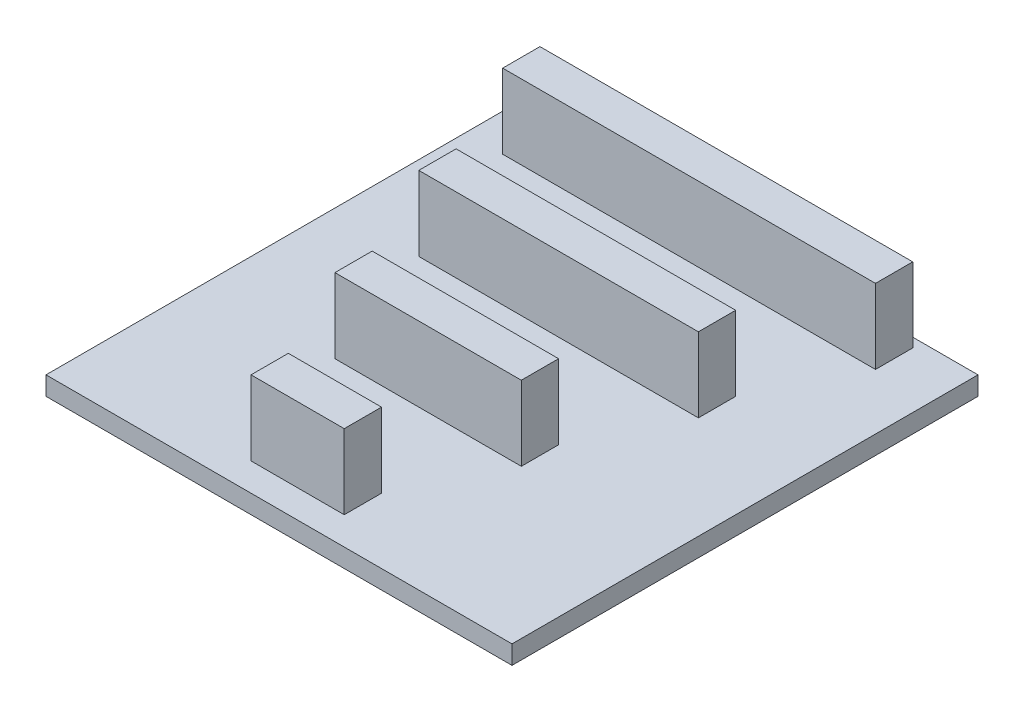
ISO-10303-21;
HEADER;
FILE_DESCRIPTION(('STEP AP214'),'2;1');
FILE_NAME('part.step','',(''),(''),'','','');
FILE_SCHEMA(('AUTOMOTIVE_DESIGN { 1 0 10303 214 1 1 1 1 }'));
ENDSEC;
DATA;
#1=APPLICATION_CONTEXT('core data for automotive mechanical design processes');
#2=APPLICATION_PROTOCOL_DEFINITION('international standard','automotive_design',2000,#1);
#3=PRODUCT_CONTEXT('',#1,'mechanical');
#4=PRODUCT('Part','Part','',(#3));
#5=PRODUCT_RELATED_PRODUCT_CATEGORY('part','',(#4));
#6=PRODUCT_DEFINITION_FORMATION('','',#4);
#7=PRODUCT_DEFINITION_CONTEXT('part definition',#1,'design');
#8=PRODUCT_DEFINITION('design','',#6,#7);
#9=PRODUCT_DEFINITION_SHAPE('','',#8);
#10=(LENGTH_UNIT() NAMED_UNIT(*) SI_UNIT(.MILLI.,.METRE.));
#11=(NAMED_UNIT(*) PLANE_ANGLE_UNIT() SI_UNIT($,.RADIAN.));
#12=(NAMED_UNIT(*) SI_UNIT($,.STERADIAN.) SOLID_ANGLE_UNIT());
#13=UNCERTAINTY_MEASURE_WITH_UNIT(LENGTH_MEASURE(1.E-05),#10,'distance_accuracy_value','');
#14=(GEOMETRIC_REPRESENTATION_CONTEXT(3) GLOBAL_UNCERTAINTY_ASSIGNED_CONTEXT((#13)) GLOBAL_UNIT_ASSIGNED_CONTEXT((#10,
#11,#12)) REPRESENTATION_CONTEXT('',''));
#15=CARTESIAN_POINT('',(0.,0.,0.));
#16=DIRECTION('',(0.,0.,1.));
#17=DIRECTION('',(1.,0.,0.));
#18=AXIS2_PLACEMENT_3D('',#15,#16,#17);
#19=CARTESIAN_POINT('',(-25.,-2.,25.));
#20=DIRECTION('',(-1.,0.,0.));
#21=DIRECTION('',(0.,0.,1.));
#22=AXIS2_PLACEMENT_3D('',#19,#20,#21);
#23=PLANE('',#22);
#24=DIRECTION('',(0.,0.,1.));
#25=VECTOR('',#24,1.);
#26=CARTESIAN_POINT('',(-25.,0.,25.));
#27=LINE('',#26,#25);
#28=CARTESIAN_POINT('',(-25.,0.,-25.));
#29=VERTEX_POINT('',#28);
#30=CARTESIAN_POINT('',(-25.,0.,25.));
#31=VERTEX_POINT('',#30);
#32=EDGE_CURVE('E108',#29,#31,#27,.T.);
#33=ORIENTED_EDGE('',*,*,#32,.F.);
#34=DIRECTION('',(0.,1.,0.));
#35=VECTOR('',#34,1.);
#36=CARTESIAN_POINT('',(-25.,-2.,-25.));
#37=LINE('',#36,#35);
#38=CARTESIAN_POINT('',(-25.,-2.,-25.));
#39=VERTEX_POINT('',#38);
#40=EDGE_CURVE('E12',#39,#29,#37,.T.);
#41=ORIENTED_EDGE('',*,*,#40,.F.);
#42=DIRECTION('',(0.,0.,1.));
#43=VECTOR('',#42,1.);
#44=CARTESIAN_POINT('',(-25.,-2.,25.));
#45=LINE('',#44,#43);
#46=CARTESIAN_POINT('',(-25.,-2.,25.));
#47=VERTEX_POINT('',#46);
#48=EDGE_CURVE('E102',#39,#47,#45,.T.);
#49=ORIENTED_EDGE('',*,*,#48,.T.);
#50=DIRECTION('',(0.,1.,0.));
#51=VECTOR('',#50,1.);
#52=CARTESIAN_POINT('',(-25.,-2.,25.));
#53=LINE('',#52,#51);
#54=EDGE_CURVE('E47',#47,#31,#53,.T.);
#55=ORIENTED_EDGE('',*,*,#54,.T.);
#56=EDGE_LOOP('',(#33,#41,#49,#55));
#57=FACE_BOUND('',#56,.T.);
#58=ADVANCED_FACE('F44',(#57),#23,.T.);
#59=CARTESIAN_POINT('',(25.,-2.,-25.));
#60=DIRECTION('',(0.,0.,-1.));
#61=DIRECTION('',(-1.,0.,0.));
#62=AXIS2_PLACEMENT_3D('',#59,#60,#61);
#63=PLANE('',#62);
#64=DIRECTION('',(-1.,0.,0.));
#65=VECTOR('',#64,1.);
#66=CARTESIAN_POINT('',(25.,0.,-25.));
#67=LINE('',#66,#65);
#68=CARTESIAN_POINT('',(25.,0.,-25.));
#69=VERTEX_POINT('',#68);
#70=EDGE_CURVE('E104',#69,#29,#67,.T.);
#71=ORIENTED_EDGE('',*,*,#70,.F.);
#72=DIRECTION('',(0.,1.,0.));
#73=VECTOR('',#72,1.);
#74=CARTESIAN_POINT('',(25.,-2.,-25.));
#75=LINE('',#74,#73);
#76=CARTESIAN_POINT('',(25.,-2.,-25.));
#77=VERTEX_POINT('',#76);
#78=EDGE_CURVE('E53',#77,#69,#75,.T.);
#79=ORIENTED_EDGE('',*,*,#78,.F.);
#80=DIRECTION('',(-1.,0.,0.));
#81=VECTOR('',#80,1.);
#82=CARTESIAN_POINT('',(25.,-2.,-25.));
#83=LINE('',#82,#81);
#84=EDGE_CURVE('E99',#77,#39,#83,.T.);
#85=ORIENTED_EDGE('',*,*,#84,.T.);
#86=ORIENTED_EDGE('',*,*,#40,.T.);
#87=EDGE_LOOP('',(#71,#79,#85,#86));
#88=FACE_BOUND('',#87,.T.);
#89=ADVANCED_FACE('F118',(#88),#63,.T.);
#90=CARTESIAN_POINT('',(25.,-2.,25.));
#91=DIRECTION('',(1.,0.,0.));
#92=DIRECTION('',(0.,0.,-1.));
#93=AXIS2_PLACEMENT_3D('',#90,#91,#92);
#94=PLANE('',#93);
#95=DIRECTION('',(0.,0.,-1.));
#96=VECTOR('',#95,1.);
#97=CARTESIAN_POINT('',(25.,0.,25.));
#98=LINE('',#97,#96);
#99=CARTESIAN_POINT('',(25.,0.,25.));
#100=VERTEX_POINT('',#99);
#101=EDGE_CURVE('E94',#100,#69,#98,.T.);
#102=ORIENTED_EDGE('',*,*,#101,.F.);
#103=DIRECTION('',(0.,1.,0.));
#104=VECTOR('',#103,1.);
#105=CARTESIAN_POINT('',(25.,-2.,25.));
#106=LINE('',#105,#104);
#107=CARTESIAN_POINT('',(25.,-2.,25.));
#108=VERTEX_POINT('',#107);
#109=EDGE_CURVE('E89',#108,#100,#106,.T.);
#110=ORIENTED_EDGE('',*,*,#109,.F.);
#111=DIRECTION('',(0.,0.,-1.));
#112=VECTOR('',#111,1.);
#113=CARTESIAN_POINT('',(25.,-2.,25.));
#114=LINE('',#113,#112);
#115=EDGE_CURVE('E92',#108,#77,#114,.T.);
#116=ORIENTED_EDGE('',*,*,#115,.T.);
#117=ORIENTED_EDGE('',*,*,#78,.T.);
#118=EDGE_LOOP('',(#102,#110,#116,#117));
#119=FACE_BOUND('',#118,.T.);
#120=ADVANCED_FACE('F91',(#119),#94,.T.);
#121=CARTESIAN_POINT('',(25.,-2.,25.));
#122=DIRECTION('',(0.,0.,1.));
#123=DIRECTION('',(1.,0.,0.));
#124=AXIS2_PLACEMENT_3D('',#121,#122,#123);
#125=PLANE('',#124);
#126=DIRECTION('',(1.,0.,0.));
#127=VECTOR('',#126,1.);
#128=CARTESIAN_POINT('',(25.,0.,25.));
#129=LINE('',#128,#127);
#130=EDGE_CURVE('E111',#31,#100,#129,.T.);
#131=ORIENTED_EDGE('',*,*,#130,.F.);
#132=ORIENTED_EDGE('',*,*,#54,.F.);
#133=DIRECTION('',(1.,0.,0.));
#134=VECTOR('',#133,1.);
#135=CARTESIAN_POINT('',(25.,-2.,25.));
#136=LINE('',#135,#134);
#137=EDGE_CURVE('E98',#47,#108,#136,.T.);
#138=ORIENTED_EDGE('',*,*,#137,.T.);
#139=ORIENTED_EDGE('',*,*,#109,.T.);
#140=EDGE_LOOP('',(#131,#132,#138,#139));
#141=FACE_BOUND('',#140,.T.);
#142=ADVANCED_FACE('F101',(#141),#125,.T.);
#143=CARTESIAN_POINT('',(0.,-2.,0.));
#144=DIRECTION('',(0.,1.,0.));
#145=DIRECTION('',(0.,0.,1.));
#146=AXIS2_PLACEMENT_3D('',#143,#144,#145);
#147=PLANE('',#146);
#148=ORIENTED_EDGE('',*,*,#48,.F.);
#149=ORIENTED_EDGE('',*,*,#84,.F.);
#150=ORIENTED_EDGE('',*,*,#115,.F.);
#151=ORIENTED_EDGE('',*,*,#137,.F.);
#152=EDGE_LOOP('',(#148,#149,#150,#151));
#153=FACE_BOUND('',#152,.T.);
#154=ADVANCED_FACE('F97',(#153),#147,.F.);
#155=CARTESIAN_POINT('',(0.,0.,0.));
#156=DIRECTION('',(0.,1.,0.));
#157=DIRECTION('',(0.,0.,1.));
#158=AXIS2_PLACEMENT_3D('',#155,#156,#157);
#159=PLANE('',#158);
#160=ORIENTED_EDGE('',*,*,#32,.T.);
#161=ORIENTED_EDGE('',*,*,#130,.T.);
#162=ORIENTED_EDGE('',*,*,#101,.T.);
#163=ORIENTED_EDGE('',*,*,#70,.T.);
#164=EDGE_LOOP('',(#160,#161,#162,#163));
#165=FACE_BOUND('',#164,.T.);
#166=ADVANCED_FACE('F117',(#165),#159,.T.);
#167=CLOSED_SHELL('',(#58,#89,#120,#142,#154,#166));
#168=MANIFOLD_SOLID_BREP('B2',#167);
#169=CARTESIAN_POINT('',(-20.,9.,-23.));
#170=DIRECTION('',(1.,0.,0.));
#171=DIRECTION('',(0.,0.,-1.));
#172=AXIS2_PLACEMENT_3D('',#169,#170,#171);
#173=PLANE('',#172);
#174=DIRECTION('',(0.,0.,1.));
#175=VECTOR('',#174,1.);
#176=CARTESIAN_POINT('',(-20.,1.,-23.));
#177=LINE('',#176,#175);
#178=CARTESIAN_POINT('',(-20.,1.,-23.));
#179=VERTEX_POINT('',#178);
#180=CARTESIAN_POINT('',(-20.,1.,-19.));
#181=VERTEX_POINT('',#180);
#182=EDGE_CURVE('E241',#179,#181,#177,.T.);
#183=ORIENTED_EDGE('',*,*,#182,.T.);
#184=DIRECTION('',(0.,-1.,0.));
#185=VECTOR('',#184,1.);
#186=CARTESIAN_POINT('',(-20.,9.,-19.));
#187=LINE('',#186,#185);
#188=CARTESIAN_POINT('',(-20.,9.,-19.));
#189=VERTEX_POINT('',#188);
#190=EDGE_CURVE('E42',#189,#181,#187,.T.);
#191=ORIENTED_EDGE('',*,*,#190,.F.);
#192=DIRECTION('',(0.,0.,1.));
#193=VECTOR('',#192,1.);
#194=CARTESIAN_POINT('',(-20.,9.,-23.));
#195=LINE('',#194,#193);
#196=CARTESIAN_POINT('',(-20.,9.,-23.));
#197=VERTEX_POINT('',#196);
#198=EDGE_CURVE('E229',#197,#189,#195,.T.);
#199=ORIENTED_EDGE('',*,*,#198,.F.);
#200=DIRECTION('',(0.,-1.,0.));
#201=VECTOR('',#200,1.);
#202=CARTESIAN_POINT('',(-20.,9.,-23.));
#203=LINE('',#202,#201);
#204=EDGE_CURVE('E237',#197,#179,#203,.T.);
#205=ORIENTED_EDGE('',*,*,#204,.T.);
#206=EDGE_LOOP('',(#183,#191,#199,#205));
#207=FACE_BOUND('',#206,.T.);
#208=ADVANCED_FACE('F178',(#207),#173,.F.);
#209=CARTESIAN_POINT('',(-20.,9.,-19.));
#210=DIRECTION('',(0.,0.,-1.));
#211=DIRECTION('',(-1.,0.,0.));
#212=AXIS2_PLACEMENT_3D('',#209,#210,#211);
#213=PLANE('',#212);
#214=DIRECTION('',(1.,0.,0.));
#215=VECTOR('',#214,1.);
#216=CARTESIAN_POINT('',(-20.,1.,-19.));
#217=LINE('',#216,#215);
#218=CARTESIAN_POINT('',(20.,1.,-19.));
#219=VERTEX_POINT('',#218);
#220=EDGE_CURVE('E233',#181,#219,#217,.T.);
#221=ORIENTED_EDGE('',*,*,#220,.T.);
#222=DIRECTION('',(0.,-1.,0.));
#223=VECTOR('',#222,1.);
#224=CARTESIAN_POINT('',(20.,9.,-19.));
#225=LINE('',#224,#223);
#226=CARTESIAN_POINT('',(20.,9.,-19.));
#227=VERTEX_POINT('',#226);
#228=EDGE_CURVE('E186',#227,#219,#225,.T.);
#229=ORIENTED_EDGE('',*,*,#228,.F.);
#230=DIRECTION('',(1.,0.,0.));
#231=VECTOR('',#230,1.);
#232=CARTESIAN_POINT('',(-20.,9.,-19.));
#233=LINE('',#232,#231);
#234=EDGE_CURVE('E224',#189,#227,#233,.T.);
#235=ORIENTED_EDGE('',*,*,#234,.F.);
#236=ORIENTED_EDGE('',*,*,#190,.T.);
#237=EDGE_LOOP('',(#221,#229,#235,#236));
#238=FACE_BOUND('',#237,.T.);
#239=ADVANCED_FACE('F232',(#238),#213,.F.);
#240=CARTESIAN_POINT('',(20.,9.,-23.));
#241=DIRECTION('',(-1.,0.,0.));
#242=DIRECTION('',(0.,0.,1.));
#243=AXIS2_PLACEMENT_3D('',#240,#241,#242);
#244=PLANE('',#243);
#245=DIRECTION('',(0.,0.,-1.));
#246=VECTOR('',#245,1.);
#247=CARTESIAN_POINT('',(20.,1.,-23.));
#248=LINE('',#247,#246);
#249=CARTESIAN_POINT('',(20.,1.,-23.));
#250=VERTEX_POINT('',#249);
#251=EDGE_CURVE('E211',#219,#250,#248,.T.);
#252=ORIENTED_EDGE('',*,*,#251,.T.);
#253=DIRECTION('',(0.,-1.,0.));
#254=VECTOR('',#253,1.);
#255=CARTESIAN_POINT('',(20.,9.,-23.));
#256=LINE('',#255,#254);
#257=CARTESIAN_POINT('',(20.,9.,-23.));
#258=VERTEX_POINT('',#257);
#259=EDGE_CURVE('E234',#258,#250,#256,.T.);
#260=ORIENTED_EDGE('',*,*,#259,.F.);
#261=DIRECTION('',(0.,0.,-1.));
#262=VECTOR('',#261,1.);
#263=CARTESIAN_POINT('',(20.,9.,-23.));
#264=LINE('',#263,#262);
#265=EDGE_CURVE('E227',#227,#258,#264,.T.);
#266=ORIENTED_EDGE('',*,*,#265,.F.);
#267=ORIENTED_EDGE('',*,*,#228,.T.);
#268=EDGE_LOOP('',(#252,#260,#266,#267));
#269=FACE_BOUND('',#268,.T.);
#270=ADVANCED_FACE('F235',(#269),#244,.F.);
#271=CARTESIAN_POINT('',(-20.,9.,-23.));
#272=DIRECTION('',(0.,0.,1.));
#273=DIRECTION('',(1.,0.,0.));
#274=AXIS2_PLACEMENT_3D('',#271,#272,#273);
#275=PLANE('',#274);
#276=DIRECTION('',(-1.,0.,0.));
#277=VECTOR('',#276,1.);
#278=CARTESIAN_POINT('',(-20.,1.,-23.));
#279=LINE('',#278,#277);
#280=EDGE_CURVE('E217',#250,#179,#279,.T.);
#281=ORIENTED_EDGE('',*,*,#280,.T.);
#282=ORIENTED_EDGE('',*,*,#204,.F.);
#283=DIRECTION('',(-1.,0.,0.));
#284=VECTOR('',#283,1.);
#285=CARTESIAN_POINT('',(-20.,9.,-23.));
#286=LINE('',#285,#284);
#287=EDGE_CURVE('E194',#258,#197,#286,.T.);
#288=ORIENTED_EDGE('',*,*,#287,.F.);
#289=ORIENTED_EDGE('',*,*,#259,.T.);
#290=EDGE_LOOP('',(#281,#282,#288,#289));
#291=FACE_BOUND('',#290,.T.);
#292=ADVANCED_FACE('F248',(#291),#275,.F.);
#293=CARTESIAN_POINT('',(0.,9.,0.));
#294=DIRECTION('',(0.,1.,0.));
#295=DIRECTION('',(0.,0.,1.));
#296=AXIS2_PLACEMENT_3D('',#293,#294,#295);
#297=PLANE('',#296);
#298=ORIENTED_EDGE('',*,*,#198,.T.);
#299=ORIENTED_EDGE('',*,*,#234,.T.);
#300=ORIENTED_EDGE('',*,*,#265,.T.);
#301=ORIENTED_EDGE('',*,*,#287,.T.);
#302=EDGE_LOOP('',(#298,#299,#300,#301));
#303=FACE_BOUND('',#302,.T.);
#304=ADVANCED_FACE('F225',(#303),#297,.T.);
#305=CARTESIAN_POINT('',(0.,1.,0.));
#306=DIRECTION('',(0.,1.,0.));
#307=DIRECTION('',(0.,0.,1.));
#308=AXIS2_PLACEMENT_3D('',#305,#306,#307);
#309=PLANE('',#308);
#310=ORIENTED_EDGE('',*,*,#182,.F.);
#311=ORIENTED_EDGE('',*,*,#280,.F.);
#312=ORIENTED_EDGE('',*,*,#251,.F.);
#313=ORIENTED_EDGE('',*,*,#220,.F.);
#314=EDGE_LOOP('',(#310,#311,#312,#313));
#315=FACE_BOUND('',#314,.T.);
#316=ADVANCED_FACE('F251',(#315),#309,.F.);
#317=CLOSED_SHELL('',(#208,#239,#270,#292,#304,#316));
#318=MANIFOLD_SOLID_BREP('B6',#317);
#319=CARTESIAN_POINT('',(-15.,9.,-9.00000000000002));
#320=DIRECTION('',(1.,0.,0.));
#321=DIRECTION('',(0.,0.,-1.));
#322=AXIS2_PLACEMENT_3D('',#319,#320,#321);
#323=PLANE('',#322);
#324=DIRECTION('',(0.,0.,1.));
#325=VECTOR('',#324,1.);
#326=CARTESIAN_POINT('',(-15.,1.,-9.00000000000002));
#327=LINE('',#326,#325);
#328=CARTESIAN_POINT('',(-15.,1.,-9.00000000000002));
#329=VERTEX_POINT('',#328);
#330=CARTESIAN_POINT('',(-15.,1.,-5.00000000000002));
#331=VERTEX_POINT('',#330);
#332=EDGE_CURVE('E375',#329,#331,#327,.T.);
#333=ORIENTED_EDGE('',*,*,#332,.T.);
#334=DIRECTION('',(0.,-1.,0.));
#335=VECTOR('',#334,1.);
#336=CARTESIAN_POINT('',(-15.,9.,-5.00000000000002));
#337=LINE('',#336,#335);
#338=CARTESIAN_POINT('',(-15.,9.,-5.00000000000002));
#339=VERTEX_POINT('',#338);
#340=EDGE_CURVE('E176',#339,#331,#337,.T.);
#341=ORIENTED_EDGE('',*,*,#340,.F.);
#342=DIRECTION('',(0.,0.,1.));
#343=VECTOR('',#342,1.);
#344=CARTESIAN_POINT('',(-15.,9.,-9.00000000000002));
#345=LINE('',#344,#343);
#346=CARTESIAN_POINT('',(-15.,9.,-9.00000000000002));
#347=VERTEX_POINT('',#346);
#348=EDGE_CURVE('E363',#347,#339,#345,.T.);
#349=ORIENTED_EDGE('',*,*,#348,.F.);
#350=DIRECTION('',(0.,-1.,0.));
#351=VECTOR('',#350,1.);
#352=CARTESIAN_POINT('',(-15.,9.,-9.00000000000002));
#353=LINE('',#352,#351);
#354=EDGE_CURVE('E371',#347,#329,#353,.T.);
#355=ORIENTED_EDGE('',*,*,#354,.T.);
#356=EDGE_LOOP('',(#333,#341,#349,#355));
#357=FACE_BOUND('',#356,.T.);
#358=ADVANCED_FACE('F312',(#357),#323,.F.);
#359=CARTESIAN_POINT('',(-15.,9.,-5.00000000000002));
#360=DIRECTION('',(0.,0.,-1.));
#361=DIRECTION('',(-1.,0.,0.));
#362=AXIS2_PLACEMENT_3D('',#359,#360,#361);
#363=PLANE('',#362);
#364=DIRECTION('',(1.,0.,0.));
#365=VECTOR('',#364,1.);
#366=CARTESIAN_POINT('',(-15.,1.,-5.00000000000002));
#367=LINE('',#366,#365);
#368=CARTESIAN_POINT('',(15.,1.,-5.00000000000002));
#369=VERTEX_POINT('',#368);
#370=EDGE_CURVE('E367',#331,#369,#367,.T.);
#371=ORIENTED_EDGE('',*,*,#370,.T.);
#372=DIRECTION('',(0.,-1.,0.));
#373=VECTOR('',#372,1.);
#374=CARTESIAN_POINT('',(15.,9.,-5.00000000000002));
#375=LINE('',#374,#373);
#376=CARTESIAN_POINT('',(15.,9.,-5.00000000000002));
#377=VERTEX_POINT('',#376);
#378=EDGE_CURVE('E320',#377,#369,#375,.T.);
#379=ORIENTED_EDGE('',*,*,#378,.F.);
#380=DIRECTION('',(1.,0.,0.));
#381=VECTOR('',#380,1.);
#382=CARTESIAN_POINT('',(-15.,9.,-5.00000000000002));
#383=LINE('',#382,#381);
#384=EDGE_CURVE('E358',#339,#377,#383,.T.);
#385=ORIENTED_EDGE('',*,*,#384,.F.);
#386=ORIENTED_EDGE('',*,*,#340,.T.);
#387=EDGE_LOOP('',(#371,#379,#385,#386));
#388=FACE_BOUND('',#387,.T.);
#389=ADVANCED_FACE('F366',(#388),#363,.F.);
#390=CARTESIAN_POINT('',(15.,9.,-9.00000000000002));
#391=DIRECTION('',(-1.,0.,0.));
#392=DIRECTION('',(0.,0.,1.));
#393=AXIS2_PLACEMENT_3D('',#390,#391,#392);
#394=PLANE('',#393);
#395=DIRECTION('',(0.,0.,-1.));
#396=VECTOR('',#395,1.);
#397=CARTESIAN_POINT('',(15.,1.,-9.00000000000002));
#398=LINE('',#397,#396);
#399=CARTESIAN_POINT('',(15.,1.,-9.00000000000002));
#400=VERTEX_POINT('',#399);
#401=EDGE_CURVE('E345',#369,#400,#398,.T.);
#402=ORIENTED_EDGE('',*,*,#401,.T.);
#403=DIRECTION('',(0.,-1.,0.));
#404=VECTOR('',#403,1.);
#405=CARTESIAN_POINT('',(15.,9.,-9.00000000000002));
#406=LINE('',#405,#404);
#407=CARTESIAN_POINT('',(15.,9.,-9.00000000000002));
#408=VERTEX_POINT('',#407);
#409=EDGE_CURVE('E368',#408,#400,#406,.T.);
#410=ORIENTED_EDGE('',*,*,#409,.F.);
#411=DIRECTION('',(0.,0.,-1.));
#412=VECTOR('',#411,1.);
#413=CARTESIAN_POINT('',(15.,9.,-9.00000000000002));
#414=LINE('',#413,#412);
#415=EDGE_CURVE('E361',#377,#408,#414,.T.);
#416=ORIENTED_EDGE('',*,*,#415,.F.);
#417=ORIENTED_EDGE('',*,*,#378,.T.);
#418=EDGE_LOOP('',(#402,#410,#416,#417));
#419=FACE_BOUND('',#418,.T.);
#420=ADVANCED_FACE('F369',(#419),#394,.F.);
#421=CARTESIAN_POINT('',(-15.,9.,-9.00000000000002));
#422=DIRECTION('',(0.,0.,1.));
#423=DIRECTION('',(1.,0.,0.));
#424=AXIS2_PLACEMENT_3D('',#421,#422,#423);
#425=PLANE('',#424);
#426=DIRECTION('',(-1.,0.,0.));
#427=VECTOR('',#426,1.);
#428=CARTESIAN_POINT('',(-15.,1.,-9.00000000000002));
#429=LINE('',#428,#427);
#430=EDGE_CURVE('E351',#400,#329,#429,.T.);
#431=ORIENTED_EDGE('',*,*,#430,.T.);
#432=ORIENTED_EDGE('',*,*,#354,.F.);
#433=DIRECTION('',(-1.,0.,0.));
#434=VECTOR('',#433,1.);
#435=CARTESIAN_POINT('',(-15.,9.,-9.00000000000002));
#436=LINE('',#435,#434);
#437=EDGE_CURVE('E328',#408,#347,#436,.T.);
#438=ORIENTED_EDGE('',*,*,#437,.F.);
#439=ORIENTED_EDGE('',*,*,#409,.T.);
#440=EDGE_LOOP('',(#431,#432,#438,#439));
#441=FACE_BOUND('',#440,.T.);
#442=ADVANCED_FACE('F382',(#441),#425,.F.);
#443=CARTESIAN_POINT('',(0.,9.,0.));
#444=DIRECTION('',(0.,1.,0.));
#445=DIRECTION('',(0.,0.,1.));
#446=AXIS2_PLACEMENT_3D('',#443,#444,#445);
#447=PLANE('',#446);
#448=ORIENTED_EDGE('',*,*,#348,.T.);
#449=ORIENTED_EDGE('',*,*,#384,.T.);
#450=ORIENTED_EDGE('',*,*,#415,.T.);
#451=ORIENTED_EDGE('',*,*,#437,.T.);
#452=EDGE_LOOP('',(#448,#449,#450,#451));
#453=FACE_BOUND('',#452,.T.);
#454=ADVANCED_FACE('F359',(#453),#447,.T.);
#455=CARTESIAN_POINT('',(0.,1.,0.));
#456=DIRECTION('',(0.,1.,0.));
#457=DIRECTION('',(0.,0.,1.));
#458=AXIS2_PLACEMENT_3D('',#455,#456,#457);
#459=PLANE('',#458);
#460=ORIENTED_EDGE('',*,*,#332,.F.);
#461=ORIENTED_EDGE('',*,*,#430,.F.);
#462=ORIENTED_EDGE('',*,*,#401,.F.);
#463=ORIENTED_EDGE('',*,*,#370,.F.);
#464=EDGE_LOOP('',(#460,#461,#462,#463));
#465=FACE_BOUND('',#464,.T.);
#466=ADVANCED_FACE('F385',(#465),#459,.F.);
#467=CLOSED_SHELL('',(#358,#389,#420,#442,#454,#466));
#468=MANIFOLD_SOLID_BREP('B36',#467);
#469=CARTESIAN_POINT('',(-10.,9.,4.99999999999998));
#470=DIRECTION('',(1.,0.,0.));
#471=DIRECTION('',(0.,0.,-1.));
#472=AXIS2_PLACEMENT_3D('',#469,#470,#471);
#473=PLANE('',#472);
#474=DIRECTION('',(0.,0.,1.));
#475=VECTOR('',#474,1.);
#476=CARTESIAN_POINT('',(-10.,1.,4.99999999999998));
#477=LINE('',#476,#475);
#478=CARTESIAN_POINT('',(-10.,1.,4.99999999999998));
#479=VERTEX_POINT('',#478);
#480=CARTESIAN_POINT('',(-10.,1.,8.99999999999998));
#481=VERTEX_POINT('',#480);
#482=EDGE_CURVE('E508',#479,#481,#477,.T.);
#483=ORIENTED_EDGE('',*,*,#482,.T.);
#484=DIRECTION('',(0.,-1.,0.));
#485=VECTOR('',#484,1.);
#486=CARTESIAN_POINT('',(-10.,9.,8.99999999999998));
#487=LINE('',#486,#485);
#488=CARTESIAN_POINT('',(-10.,9.,8.99999999999998));
#489=VERTEX_POINT('',#488);
#490=EDGE_CURVE('E310',#489,#481,#487,.T.);
#491=ORIENTED_EDGE('',*,*,#490,.F.);
#492=DIRECTION('',(0.,0.,1.));
#493=VECTOR('',#492,1.);
#494=CARTESIAN_POINT('',(-10.,9.,4.99999999999998));
#495=LINE('',#494,#493);
#496=CARTESIAN_POINT('',(-10.,9.,4.99999999999998));
#497=VERTEX_POINT('',#496);
#498=EDGE_CURVE('E496',#497,#489,#495,.T.);
#499=ORIENTED_EDGE('',*,*,#498,.F.);
#500=DIRECTION('',(0.,-1.,0.));
#501=VECTOR('',#500,1.);
#502=CARTESIAN_POINT('',(-10.,9.,4.99999999999998));
#503=LINE('',#502,#501);
#504=EDGE_CURVE('E504',#497,#479,#503,.T.);
#505=ORIENTED_EDGE('',*,*,#504,.T.);
#506=EDGE_LOOP('',(#483,#491,#499,#505));
#507=FACE_BOUND('',#506,.T.);
#508=ADVANCED_FACE('F445',(#507),#473,.F.);
#509=CARTESIAN_POINT('',(-10.,9.,8.99999999999998));
#510=DIRECTION('',(0.,0.,-1.));
#511=DIRECTION('',(-1.,0.,0.));
#512=AXIS2_PLACEMENT_3D('',#509,#510,#511);
#513=PLANE('',#512);
#514=DIRECTION('',(1.,0.,0.));
#515=VECTOR('',#514,1.);
#516=CARTESIAN_POINT('',(-10.,1.,8.99999999999998));
#517=LINE('',#516,#515);
#518=CARTESIAN_POINT('',(10.,1.,8.99999999999998));
#519=VERTEX_POINT('',#518);
#520=EDGE_CURVE('E500',#481,#519,#517,.T.);
#521=ORIENTED_EDGE('',*,*,#520,.T.);
#522=DIRECTION('',(0.,-1.,0.));
#523=VECTOR('',#522,1.);
#524=CARTESIAN_POINT('',(10.,9.,8.99999999999998));
#525=LINE('',#524,#523);
#526=CARTESIAN_POINT('',(10.,9.,8.99999999999998));
#527=VERTEX_POINT('',#526);
#528=EDGE_CURVE('E453',#527,#519,#525,.T.);
#529=ORIENTED_EDGE('',*,*,#528,.F.);
#530=DIRECTION('',(1.,0.,0.));
#531=VECTOR('',#530,1.);
#532=CARTESIAN_POINT('',(-10.,9.,8.99999999999998));
#533=LINE('',#532,#531);
#534=EDGE_CURVE('E491',#489,#527,#533,.T.);
#535=ORIENTED_EDGE('',*,*,#534,.F.);
#536=ORIENTED_EDGE('',*,*,#490,.T.);
#537=EDGE_LOOP('',(#521,#529,#535,#536));
#538=FACE_BOUND('',#537,.T.);
#539=ADVANCED_FACE('F499',(#538),#513,.F.);
#540=CARTESIAN_POINT('',(10.,9.,4.99999999999998));
#541=DIRECTION('',(-1.,0.,0.));
#542=DIRECTION('',(0.,0.,1.));
#543=AXIS2_PLACEMENT_3D('',#540,#541,#542);
#544=PLANE('',#543);
#545=DIRECTION('',(0.,0.,-1.));
#546=VECTOR('',#545,1.);
#547=CARTESIAN_POINT('',(10.,1.,4.99999999999998));
#548=LINE('',#547,#546);
#549=CARTESIAN_POINT('',(10.,1.,4.99999999999998));
#550=VERTEX_POINT('',#549);
#551=EDGE_CURVE('E478',#519,#550,#548,.T.);
#552=ORIENTED_EDGE('',*,*,#551,.T.);
#553=DIRECTION('',(0.,-1.,0.));
#554=VECTOR('',#553,1.);
#555=CARTESIAN_POINT('',(10.,9.,4.99999999999998));
#556=LINE('',#555,#554);
#557=CARTESIAN_POINT('',(10.,9.,4.99999999999998));
#558=VERTEX_POINT('',#557);
#559=EDGE_CURVE('E501',#558,#550,#556,.T.);
#560=ORIENTED_EDGE('',*,*,#559,.F.);
#561=DIRECTION('',(0.,0.,-1.));
#562=VECTOR('',#561,1.);
#563=CARTESIAN_POINT('',(10.,9.,4.99999999999998));
#564=LINE('',#563,#562);
#565=EDGE_CURVE('E494',#527,#558,#564,.T.);
#566=ORIENTED_EDGE('',*,*,#565,.F.);
#567=ORIENTED_EDGE('',*,*,#528,.T.);
#568=EDGE_LOOP('',(#552,#560,#566,#567));
#569=FACE_BOUND('',#568,.T.);
#570=ADVANCED_FACE('F502',(#569),#544,.F.);
#571=CARTESIAN_POINT('',(-10.,9.,4.99999999999998));
#572=DIRECTION('',(0.,0.,1.));
#573=DIRECTION('',(1.,0.,0.));
#574=AXIS2_PLACEMENT_3D('',#571,#572,#573);
#575=PLANE('',#574);
#576=DIRECTION('',(-1.,0.,0.));
#577=VECTOR('',#576,1.);
#578=CARTESIAN_POINT('',(-10.,1.,4.99999999999998));
#579=LINE('',#578,#577);
#580=EDGE_CURVE('E484',#550,#479,#579,.T.);
#581=ORIENTED_EDGE('',*,*,#580,.T.);
#582=ORIENTED_EDGE('',*,*,#504,.F.);
#583=DIRECTION('',(-1.,0.,0.));
#584=VECTOR('',#583,1.);
#585=CARTESIAN_POINT('',(-10.,9.,4.99999999999998));
#586=LINE('',#585,#584);
#587=EDGE_CURVE('E461',#558,#497,#586,.T.);
#588=ORIENTED_EDGE('',*,*,#587,.F.);
#589=ORIENTED_EDGE('',*,*,#559,.T.);
#590=EDGE_LOOP('',(#581,#582,#588,#589));
#591=FACE_BOUND('',#590,.T.);
#592=ADVANCED_FACE('F515',(#591),#575,.F.);
#593=CARTESIAN_POINT('',(0.,9.,0.));
#594=DIRECTION('',(0.,1.,0.));
#595=DIRECTION('',(0.,0.,1.));
#596=AXIS2_PLACEMENT_3D('',#593,#594,#595);
#597=PLANE('',#596);
#598=ORIENTED_EDGE('',*,*,#498,.T.);
#599=ORIENTED_EDGE('',*,*,#534,.T.);
#600=ORIENTED_EDGE('',*,*,#565,.T.);
#601=ORIENTED_EDGE('',*,*,#587,.T.);
#602=EDGE_LOOP('',(#598,#599,#600,#601));
#603=FACE_BOUND('',#602,.T.);
#604=ADVANCED_FACE('F492',(#603),#597,.T.);
#605=CARTESIAN_POINT('',(0.,1.,0.));
#606=DIRECTION('',(0.,1.,0.));
#607=DIRECTION('',(0.,0.,1.));
#608=AXIS2_PLACEMENT_3D('',#605,#606,#607);
#609=PLANE('',#608);
#610=ORIENTED_EDGE('',*,*,#482,.F.);
#611=ORIENTED_EDGE('',*,*,#580,.F.);
#612=ORIENTED_EDGE('',*,*,#551,.F.);
#613=ORIENTED_EDGE('',*,*,#520,.F.);
#614=EDGE_LOOP('',(#610,#611,#612,#613));
#615=FACE_BOUND('',#614,.T.);
#616=ADVANCED_FACE('F518',(#615),#609,.F.);
#617=CLOSED_SHELL('',(#508,#539,#570,#592,#604,#616));
#618=MANIFOLD_SOLID_BREP('B170',#617);
#619=CARTESIAN_POINT('',(-5.,9.,19.));
#620=DIRECTION('',(1.,0.,0.));
#621=DIRECTION('',(0.,0.,-1.));
#622=AXIS2_PLACEMENT_3D('',#619,#620,#621);
#623=PLANE('',#622);
#624=DIRECTION('',(0.,0.,1.));
#625=VECTOR('',#624,1.);
#626=CARTESIAN_POINT('',(-5.,1.,19.));
#627=LINE('',#626,#625);
#628=CARTESIAN_POINT('',(-5.,1.,19.));
#629=VERTEX_POINT('',#628);
#630=CARTESIAN_POINT('',(-5.,1.,23.));
#631=VERTEX_POINT('',#630);
#632=EDGE_CURVE('E632',#629,#631,#627,.T.);
#633=ORIENTED_EDGE('',*,*,#632,.T.);
#634=DIRECTION('',(0.,-1.,0.));
#635=VECTOR('',#634,1.);
#636=CARTESIAN_POINT('',(-5.,9.,23.));
#637=LINE('',#636,#635);
#638=CARTESIAN_POINT('',(-5.,9.,23.));
#639=VERTEX_POINT('',#638);
#640=EDGE_CURVE('E443',#639,#631,#637,.T.);
#641=ORIENTED_EDGE('',*,*,#640,.F.);
#642=DIRECTION('',(0.,0.,1.));
#643=VECTOR('',#642,1.);
#644=CARTESIAN_POINT('',(-5.,9.,19.));
#645=LINE('',#644,#643);
#646=CARTESIAN_POINT('',(-5.,9.,19.));
#647=VERTEX_POINT('',#646);
#648=EDGE_CURVE('E620',#647,#639,#645,.T.);
#649=ORIENTED_EDGE('',*,*,#648,.F.);
#650=DIRECTION('',(0.,-1.,0.));
#651=VECTOR('',#650,1.);
#652=CARTESIAN_POINT('',(-5.,9.,19.));
#653=LINE('',#652,#651);
#654=EDGE_CURVE('E628',#647,#629,#653,.T.);
#655=ORIENTED_EDGE('',*,*,#654,.T.);
#656=EDGE_LOOP('',(#633,#641,#649,#655));
#657=FACE_BOUND('',#656,.T.);
#658=ADVANCED_FACE('F569',(#657),#623,.F.);
#659=CARTESIAN_POINT('',(-5.,9.,23.));
#660=DIRECTION('',(0.,0.,-1.));
#661=DIRECTION('',(-1.,0.,0.));
#662=AXIS2_PLACEMENT_3D('',#659,#660,#661);
#663=PLANE('',#662);
#664=DIRECTION('',(1.,0.,0.));
#665=VECTOR('',#664,1.);
#666=CARTESIAN_POINT('',(-5.,1.,23.));
#667=LINE('',#666,#665);
#668=CARTESIAN_POINT('',(5.,1.,23.));
#669=VERTEX_POINT('',#668);
#670=EDGE_CURVE('E624',#631,#669,#667,.T.);
#671=ORIENTED_EDGE('',*,*,#670,.T.);
#672=DIRECTION('',(0.,-1.,0.));
#673=VECTOR('',#672,1.);
#674=CARTESIAN_POINT('',(5.,9.,23.));
#675=LINE('',#674,#673);
#676=CARTESIAN_POINT('',(5.,9.,23.));
#677=VERTEX_POINT('',#676);
#678=EDGE_CURVE('E577',#677,#669,#675,.T.);
#679=ORIENTED_EDGE('',*,*,#678,.F.);
#680=DIRECTION('',(1.,0.,0.));
#681=VECTOR('',#680,1.);
#682=CARTESIAN_POINT('',(-5.,9.,23.));
#683=LINE('',#682,#681);
#684=EDGE_CURVE('E615',#639,#677,#683,.T.);
#685=ORIENTED_EDGE('',*,*,#684,.F.);
#686=ORIENTED_EDGE('',*,*,#640,.T.);
#687=EDGE_LOOP('',(#671,#679,#685,#686));
#688=FACE_BOUND('',#687,.T.);
#689=ADVANCED_FACE('F623',(#688),#663,.F.);
#690=CARTESIAN_POINT('',(5.,9.,19.));
#691=DIRECTION('',(-1.,0.,0.));
#692=DIRECTION('',(0.,0.,1.));
#693=AXIS2_PLACEMENT_3D('',#690,#691,#692);
#694=PLANE('',#693);
#695=DIRECTION('',(0.,0.,-1.));
#696=VECTOR('',#695,1.);
#697=CARTESIAN_POINT('',(5.,1.,19.));
#698=LINE('',#697,#696);
#699=CARTESIAN_POINT('',(5.,1.,19.));
#700=VERTEX_POINT('',#699);
#701=EDGE_CURVE('E602',#669,#700,#698,.T.);
#702=ORIENTED_EDGE('',*,*,#701,.T.);
#703=DIRECTION('',(0.,-1.,0.));
#704=VECTOR('',#703,1.);
#705=CARTESIAN_POINT('',(5.,9.,19.));
#706=LINE('',#705,#704);
#707=CARTESIAN_POINT('',(5.,9.,19.));
#708=VERTEX_POINT('',#707);
#709=EDGE_CURVE('E625',#708,#700,#706,.T.);
#710=ORIENTED_EDGE('',*,*,#709,.F.);
#711=DIRECTION('',(0.,0.,-1.));
#712=VECTOR('',#711,1.);
#713=CARTESIAN_POINT('',(5.,9.,19.));
#714=LINE('',#713,#712);
#715=EDGE_CURVE('E618',#677,#708,#714,.T.);
#716=ORIENTED_EDGE('',*,*,#715,.F.);
#717=ORIENTED_EDGE('',*,*,#678,.T.);
#718=EDGE_LOOP('',(#702,#710,#716,#717));
#719=FACE_BOUND('',#718,.T.);
#720=ADVANCED_FACE('F626',(#719),#694,.F.);
#721=CARTESIAN_POINT('',(-5.,9.,19.));
#722=DIRECTION('',(0.,0.,1.));
#723=DIRECTION('',(1.,0.,0.));
#724=AXIS2_PLACEMENT_3D('',#721,#722,#723);
#725=PLANE('',#724);
#726=DIRECTION('',(-1.,0.,0.));
#727=VECTOR('',#726,1.);
#728=CARTESIAN_POINT('',(-5.,1.,19.));
#729=LINE('',#728,#727);
#730=EDGE_CURVE('E608',#700,#629,#729,.T.);
#731=ORIENTED_EDGE('',*,*,#730,.T.);
#732=ORIENTED_EDGE('',*,*,#654,.F.);
#733=DIRECTION('',(-1.,0.,0.));
#734=VECTOR('',#733,1.);
#735=CARTESIAN_POINT('',(-5.,9.,19.));
#736=LINE('',#735,#734);
#737=EDGE_CURVE('E585',#708,#647,#736,.T.);
#738=ORIENTED_EDGE('',*,*,#737,.F.);
#739=ORIENTED_EDGE('',*,*,#709,.T.);
#740=EDGE_LOOP('',(#731,#732,#738,#739));
#741=FACE_BOUND('',#740,.T.);
#742=ADVANCED_FACE('F639',(#741),#725,.F.);
#743=CARTESIAN_POINT('',(0.,9.,0.));
#744=DIRECTION('',(0.,1.,0.));
#745=DIRECTION('',(0.,0.,1.));
#746=AXIS2_PLACEMENT_3D('',#743,#744,#745);
#747=PLANE('',#746);
#748=ORIENTED_EDGE('',*,*,#648,.T.);
#749=ORIENTED_EDGE('',*,*,#684,.T.);
#750=ORIENTED_EDGE('',*,*,#715,.T.);
#751=ORIENTED_EDGE('',*,*,#737,.T.);
#752=EDGE_LOOP('',(#748,#749,#750,#751));
#753=FACE_BOUND('',#752,.T.);
#754=ADVANCED_FACE('F616',(#753),#747,.T.);
#755=CARTESIAN_POINT('',(0.,1.,0.));
#756=DIRECTION('',(0.,1.,0.));
#757=DIRECTION('',(0.,0.,1.));
#758=AXIS2_PLACEMENT_3D('',#755,#756,#757);
#759=PLANE('',#758);
#760=ORIENTED_EDGE('',*,*,#632,.F.);
#761=ORIENTED_EDGE('',*,*,#730,.F.);
#762=ORIENTED_EDGE('',*,*,#701,.F.);
#763=ORIENTED_EDGE('',*,*,#670,.F.);
#764=EDGE_LOOP('',(#760,#761,#762,#763));
#765=FACE_BOUND('',#764,.T.);
#766=ADVANCED_FACE('F642',(#765),#759,.F.);
#767=CLOSED_SHELL('',(#658,#689,#720,#742,#754,#766));
#768=MANIFOLD_SOLID_BREP('B304',#767);
#769=ADVANCED_BREP_SHAPE_REPRESENTATION('',(#18,#168,#318,#468,#618,#768),#14);
#770=SHAPE_DEFINITION_REPRESENTATION(#9,#769);
ENDSEC;
END-ISO-10303-21;
